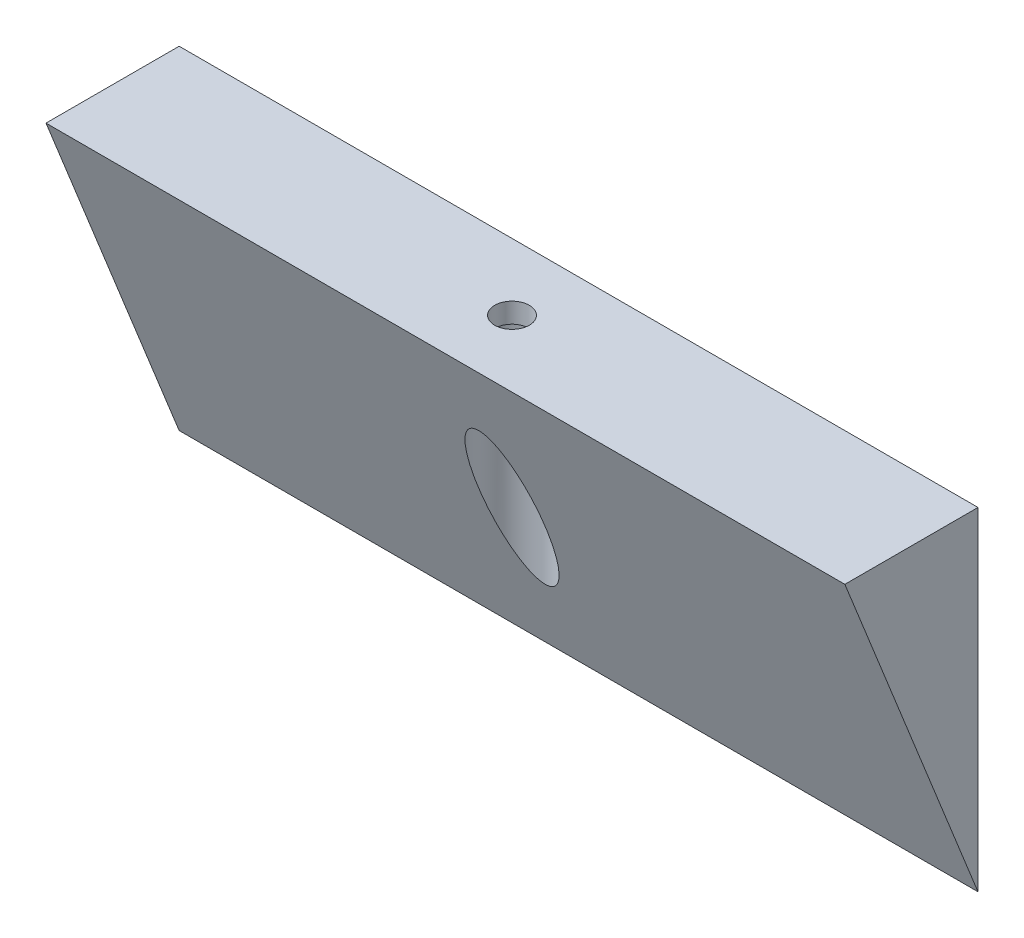
ISO-10303-21;
HEADER;
FILE_DESCRIPTION(('STEP AP214'),'2;1');
FILE_NAME('part.step','',(''),(''),'','','');
FILE_SCHEMA(('AUTOMOTIVE_DESIGN { 1 0 10303 214 1 1 1 1 }'));
ENDSEC;
DATA;
#1=APPLICATION_CONTEXT('core data for automotive mechanical design processes');
#2=APPLICATION_PROTOCOL_DEFINITION('international standard','automotive_design',2000,#1);
#3=PRODUCT_CONTEXT('',#1,'mechanical');
#4=PRODUCT('Part','Part','',(#3));
#5=PRODUCT_RELATED_PRODUCT_CATEGORY('part','',(#4));
#6=PRODUCT_DEFINITION_FORMATION('','',#4);
#7=PRODUCT_DEFINITION_CONTEXT('part definition',#1,'design');
#8=PRODUCT_DEFINITION('design','',#6,#7);
#9=PRODUCT_DEFINITION_SHAPE('','',#8);
#10=(LENGTH_UNIT() NAMED_UNIT(*) SI_UNIT(.MILLI.,.METRE.));
#11=(NAMED_UNIT(*) PLANE_ANGLE_UNIT() SI_UNIT($,.RADIAN.));
#12=(NAMED_UNIT(*) SI_UNIT($,.STERADIAN.) SOLID_ANGLE_UNIT());
#13=UNCERTAINTY_MEASURE_WITH_UNIT(LENGTH_MEASURE(1.E-05),#10,'distance_accuracy_value','');
#14=(GEOMETRIC_REPRESENTATION_CONTEXT(3) GLOBAL_UNCERTAINTY_ASSIGNED_CONTEXT((#13)) GLOBAL_UNIT_ASSIGNED_CONTEXT((#10,
#11,#12)) REPRESENTATION_CONTEXT('',''));
#15=CARTESIAN_POINT('',(0.,0.,0.));
#16=DIRECTION('',(0.,0.,1.));
#17=DIRECTION('',(1.,0.,0.));
#18=AXIS2_PLACEMENT_3D('',#15,#16,#17);
#19=CARTESIAN_POINT('',(180.,-250.,-10.));
#20=DIRECTION('',(0.,1.,0.));
#21=DIRECTION('',(0.,0.,1.));
#22=AXIS2_PLACEMENT_3D('',#19,#20,#21);
#23=CYLINDRICAL_SURFACE('',#22,5.);
#24=CARTESIAN_POINT('',(180.,25.,-10.));
#25=DIRECTION('',(0.,-0.371390676354104,0.928476690885259));
#26=DIRECTION('',(0.,0.928476690885259,0.371390676354104));
#27=AXIS2_PLACEMENT_3D('',#24,#25,#26);
#28=ELLIPSE('',#27,13.4629120178363,5.);
#29=CARTESIAN_POINT('',(180.,37.5,-5.));
#30=VERTEX_POINT('',#29);
#31=EDGE_CURVE('E91',#30,#30,#28,.F.);
#32=ORIENTED_EDGE('',*,*,#31,.F.);
#33=EDGE_LOOP('',(#32));
#34=FACE_BOUND('',#33,.T.);
#35=CARTESIAN_POINT('',(180.,47.,-10.));
#36=DIRECTION('',(0.,-1.,0.));
#37=DIRECTION('',(0.,0.,1.));
#38=AXIS2_PLACEMENT_3D('',#35,#36,#37);
#39=CIRCLE('',#38,5.);
#40=CARTESIAN_POINT('',(180.,47.,-5.));
#41=VERTEX_POINT('',#40);
#42=EDGE_CURVE('E107',#41,#41,#39,.T.);
#43=ORIENTED_EDGE('',*,*,#42,.F.);
#44=EDGE_LOOP('',(#43));
#45=FACE_BOUND('',#44,.T.);
#46=ADVANCED_FACE('F38',(#34,#45),#23,.F.);
#47=CARTESIAN_POINT('',(0.,50.,-20.));
#48=DIRECTION('',(0.,0.,1.));
#49=DIRECTION('',(1.,0.,0.));
#50=AXIS2_PLACEMENT_3D('',#47,#48,#49);
#51=PLANE('',#50);
#52=DIRECTION('',(-1.,0.,0.));
#53=VECTOR('',#52,1.);
#54=CARTESIAN_POINT('',(0.,0.,-20.));
#55=LINE('',#54,#53);
#56=CARTESIAN_POINT('',(240.,0.,-20.));
#57=VERTEX_POINT('',#56);
#58=CARTESIAN_POINT('',(120.,0.,-20.));
#59=VERTEX_POINT('',#58);
#60=EDGE_CURVE('E80',#57,#59,#55,.T.);
#61=ORIENTED_EDGE('',*,*,#60,.T.);
#62=DIRECTION('',(0.,1.,0.));
#63=VECTOR('',#62,1.);
#64=CARTESIAN_POINT('',(120.,-50.,-20.));
#65=LINE('',#64,#63);
#66=CARTESIAN_POINT('',(120.,50.,-20.));
#67=VERTEX_POINT('',#66);
#68=EDGE_CURVE('E53',#59,#67,#65,.T.);
#69=ORIENTED_EDGE('',*,*,#68,.T.);
#70=DIRECTION('',(-1.,0.,0.));
#71=VECTOR('',#70,1.);
#72=CARTESIAN_POINT('',(0.,50.,-20.));
#73=LINE('',#72,#71);
#74=CARTESIAN_POINT('',(240.,50.,-20.));
#75=VERTEX_POINT('',#74);
#76=EDGE_CURVE('E47',#75,#67,#73,.T.);
#77=ORIENTED_EDGE('',*,*,#76,.F.);
#78=DIRECTION('',(0.,-1.,0.));
#79=VECTOR('',#78,1.);
#80=CARTESIAN_POINT('',(240.,50.,-20.));
#81=LINE('',#80,#79);
#82=EDGE_CURVE('E88',#75,#57,#81,.T.);
#83=ORIENTED_EDGE('',*,*,#82,.T.);
#84=EDGE_LOOP('',(#61,#69,#77,#83));
#85=FACE_BOUND('',#84,.T.);
#86=ADVANCED_FACE('F40',(#85),#51,.F.);
#87=CARTESIAN_POINT('',(240.,50.,0.));
#88=DIRECTION('',(1.,0.,0.));
#89=DIRECTION('',(0.,0.,-1.));
#90=AXIS2_PLACEMENT_3D('',#87,#88,#89);
#91=PLANE('',#90);
#92=DIRECTION('',(0.,0.928476690885259,0.371390676354104));
#93=VECTOR('',#92,1.);
#94=CARTESIAN_POINT('',(240.,50.,0.));
#95=LINE('',#94,#93);
#96=CARTESIAN_POINT('',(240.,50.,0.));
#97=VERTEX_POINT('',#96);
#98=EDGE_CURVE('E73',#57,#97,#95,.T.);
#99=ORIENTED_EDGE('',*,*,#98,.F.);
#100=ORIENTED_EDGE('',*,*,#82,.F.);
#101=DIRECTION('',(0.,0.,1.));
#102=VECTOR('',#101,1.);
#103=CARTESIAN_POINT('',(240.,50.,0.));
#104=LINE('',#103,#102);
#105=EDGE_CURVE('E86',#75,#97,#104,.T.);
#106=ORIENTED_EDGE('',*,*,#105,.T.);
#107=EDGE_LOOP('',(#99,#100,#106));
#108=FACE_BOUND('',#107,.T.);
#109=ADVANCED_FACE('F87',(#108),#91,.T.);
#110=CARTESIAN_POINT('',(0.,50.,0.));
#111=DIRECTION('',(0.,-1.,0.));
#112=DIRECTION('',(0.,0.,-1.));
#113=AXIS2_PLACEMENT_3D('',#110,#111,#112);
#114=PLANE('',#113);
#115=ORIENTED_EDGE('',*,*,#76,.T.);
#116=DIRECTION('',(0.,0.,-1.));
#117=VECTOR('',#116,1.);
#118=CARTESIAN_POINT('',(120.,50.,-20.));
#119=LINE('',#118,#117);
#120=CARTESIAN_POINT('',(120.,50.,0.));
#121=VERTEX_POINT('',#120);
#122=EDGE_CURVE('E83',#121,#67,#119,.T.);
#123=ORIENTED_EDGE('',*,*,#122,.F.);
#124=DIRECTION('',(-1.,0.,0.));
#125=VECTOR('',#124,1.);
#126=CARTESIAN_POINT('',(240.,50.,0.));
#127=LINE('',#126,#125);
#128=EDGE_CURVE('E78',#97,#121,#127,.T.);
#129=ORIENTED_EDGE('',*,*,#128,.F.);
#130=ORIENTED_EDGE('',*,*,#105,.F.);
#131=EDGE_LOOP('',(#115,#123,#129,#130));
#132=FACE_BOUND('',#131,.T.);
#133=CARTESIAN_POINT('',(180.,50.,-10.));
#134=DIRECTION('',(0.,-1.,0.));
#135=DIRECTION('',(0.,0.,1.));
#136=AXIS2_PLACEMENT_3D('',#133,#134,#135);
#137=CIRCLE('',#136,2.6);
#138=CARTESIAN_POINT('',(180.,50.,-7.4));
#139=VERTEX_POINT('',#138);
#140=EDGE_CURVE('E116',#139,#139,#137,.T.);
#141=ORIENTED_EDGE('',*,*,#140,.T.);
#142=EDGE_LOOP('',(#141));
#143=FACE_BOUND('',#142,.T.);
#144=ADVANCED_FACE('F94',(#132,#143),#114,.F.);
#145=CARTESIAN_POINT('',(5.99999999999999,50.,0.));
#146=DIRECTION('',(0.,-0.371390676354104,0.928476690885259));
#147=DIRECTION('',(0.,-0.928476690885259,-0.371390676354104));
#148=AXIS2_PLACEMENT_3D('',#145,#146,#147);
#149=PLANE('',#148);
#150=DIRECTION('',(0.,0.928476690885259,0.371390676354104));
#151=VECTOR('',#150,1.);
#152=CARTESIAN_POINT('',(120.,50.,0.));
#153=LINE('',#152,#151);
#154=EDGE_CURVE('E11',#59,#121,#153,.T.);
#155=ORIENTED_EDGE('',*,*,#154,.F.);
#156=ORIENTED_EDGE('',*,*,#60,.F.);
#157=ORIENTED_EDGE('',*,*,#98,.T.);
#158=ORIENTED_EDGE('',*,*,#128,.T.);
#159=EDGE_LOOP('',(#155,#156,#157,#158));
#160=FACE_BOUND('',#159,.T.);
#161=ORIENTED_EDGE('',*,*,#31,.T.);
#162=EDGE_LOOP('',(#161));
#163=FACE_BOUND('',#162,.T.);
#164=ADVANCED_FACE('F75',(#160,#163),#149,.T.);
#165=CARTESIAN_POINT('',(180.,47.,-10.));
#166=DIRECTION('',(0.,1.,0.));
#167=DIRECTION('',(0.,0.,1.));
#168=AXIS2_PLACEMENT_3D('',#165,#166,#167);
#169=PLANE('',#168);
#170=ORIENTED_EDGE('',*,*,#42,.T.);
#171=EDGE_LOOP('',(#170));
#172=FACE_BOUND('',#171,.T.);
#173=CARTESIAN_POINT('',(180.,47.,-10.));
#174=DIRECTION('',(0.,-1.,0.));
#175=DIRECTION('',(0.,0.,1.));
#176=AXIS2_PLACEMENT_3D('',#173,#174,#175);
#177=CIRCLE('',#176,2.6);
#178=CARTESIAN_POINT('',(180.,47.,-7.4));
#179=VERTEX_POINT('',#178);
#180=EDGE_CURVE('E111',#179,#179,#177,.T.);
#181=ORIENTED_EDGE('',*,*,#180,.F.);
#182=EDGE_LOOP('',(#181));
#183=FACE_BOUND('',#182,.T.);
#184=ADVANCED_FACE('F138',(#172,#183),#169,.F.);
#185=CARTESIAN_POINT('',(180.,47.,-10.));
#186=DIRECTION('',(0.,1.,0.));
#187=DIRECTION('',(0.,0.,1.));
#188=AXIS2_PLACEMENT_3D('',#185,#186,#187);
#189=CYLINDRICAL_SURFACE('',#188,2.6);
#190=ORIENTED_EDGE('',*,*,#180,.T.);
#191=EDGE_LOOP('',(#190));
#192=FACE_BOUND('',#191,.T.);
#193=ORIENTED_EDGE('',*,*,#140,.F.);
#194=EDGE_LOOP('',(#193));
#195=FACE_BOUND('',#194,.T.);
#196=ADVANCED_FACE('F157',(#192,#195),#189,.F.);
#197=CARTESIAN_POINT('',(120.,-50.,-20.));
#198=DIRECTION('',(1.,0.,0.));
#199=DIRECTION('',(0.,0.,-1.));
#200=AXIS2_PLACEMENT_3D('',#197,#198,#199);
#201=PLANE('',#200);
#202=ORIENTED_EDGE('',*,*,#154,.T.);
#203=ORIENTED_EDGE('',*,*,#122,.T.);
#204=ORIENTED_EDGE('',*,*,#68,.F.);
#205=EDGE_LOOP('',(#202,#203,#204));
#206=FACE_BOUND('',#205,.T.);
#207=ADVANCED_FACE('F125',(#206),#201,.F.);
#208=CLOSED_SHELL('',(#46,#86,#109,#144,#164,#184,#196,#207));
#209=MANIFOLD_SOLID_BREP('B2',#208);
#210=ADVANCED_BREP_SHAPE_REPRESENTATION('',(#18,#209),#14);
#211=SHAPE_DEFINITION_REPRESENTATION(#9,#210);
ENDSEC;
END-ISO-10303-21;
